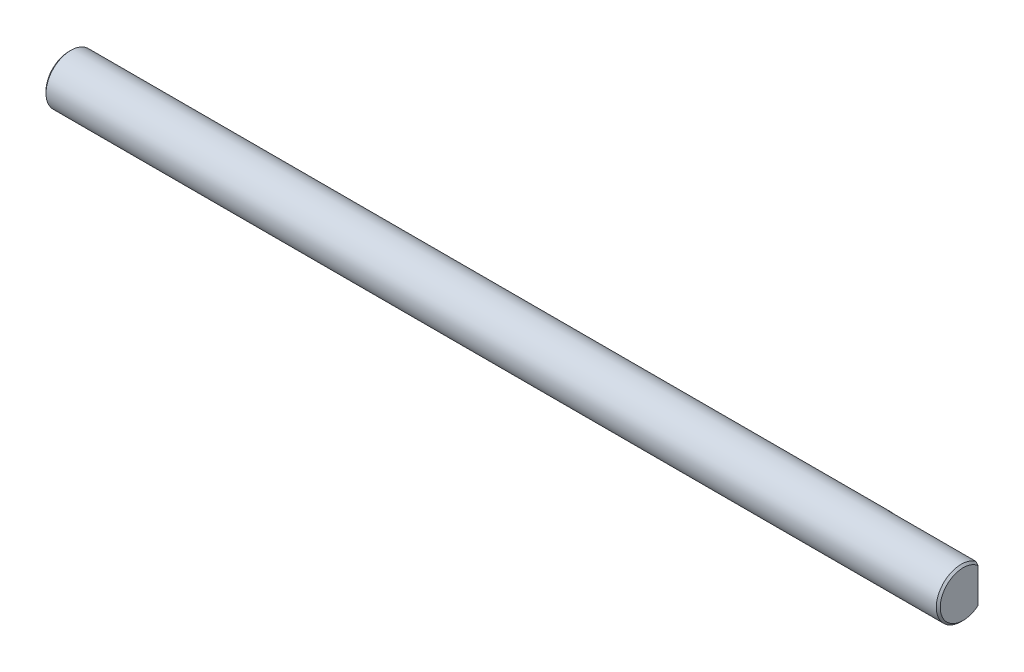
ISO-10303-21;
HEADER;
FILE_DESCRIPTION(('STEP AP214'),'2;1');
FILE_NAME('part.step','',(''),(''),'','','');
FILE_SCHEMA(('AUTOMOTIVE_DESIGN { 1 0 10303 214 1 1 1 1 }'));
ENDSEC;
DATA;
#1=APPLICATION_CONTEXT('core data for automotive mechanical design processes');
#2=APPLICATION_PROTOCOL_DEFINITION('international standard','automotive_design',2000,#1);
#3=PRODUCT_CONTEXT('',#1,'mechanical');
#4=PRODUCT('Part','Part','',(#3));
#5=PRODUCT_RELATED_PRODUCT_CATEGORY('part','',(#4));
#6=PRODUCT_DEFINITION_FORMATION('','',#4);
#7=PRODUCT_DEFINITION_CONTEXT('part definition',#1,'design');
#8=PRODUCT_DEFINITION('design','',#6,#7);
#9=PRODUCT_DEFINITION_SHAPE('','',#8);
#10=(LENGTH_UNIT() NAMED_UNIT(*) SI_UNIT(.MILLI.,.METRE.));
#11=(NAMED_UNIT(*) PLANE_ANGLE_UNIT() SI_UNIT($,.RADIAN.));
#12=(NAMED_UNIT(*) SI_UNIT($,.STERADIAN.) SOLID_ANGLE_UNIT());
#13=UNCERTAINTY_MEASURE_WITH_UNIT(LENGTH_MEASURE(1.E-05),#10,'distance_accuracy_value','');
#14=(GEOMETRIC_REPRESENTATION_CONTEXT(3) GLOBAL_UNCERTAINTY_ASSIGNED_CONTEXT((#13)) GLOBAL_UNIT_ASSIGNED_CONTEXT((#10,
#11,#12)) REPRESENTATION_CONTEXT('',''));
#15=CARTESIAN_POINT('',(0.,0.,0.));
#16=DIRECTION('',(0.,0.,1.));
#17=DIRECTION('',(1.,0.,0.));
#18=AXIS2_PLACEMENT_3D('',#15,#16,#17);
#19=CARTESIAN_POINT('',(0.,0.,0.));
#20=DIRECTION('',(1.,0.,0.));
#21=DIRECTION('',(0.,0.,-1.));
#22=AXIS2_PLACEMENT_3D('',#19,#20,#21);
#23=PLANE('',#22);
#24=DIRECTION('',(0.,1.,0.));
#25=VECTOR('',#24,1.);
#26=CARTESIAN_POINT('',(0.,-2.5,-1.5));
#27=LINE('',#26,#25);
#28=CARTESIAN_POINT('',(0.,-1.74355957741628,-1.5));
#29=VERTEX_POINT('',#28);
#30=CARTESIAN_POINT('',(0.,1.74355957741628,-1.5));
#31=VERTEX_POINT('',#30);
#32=EDGE_CURVE('E88',#29,#31,#27,.T.);
#33=ORIENTED_EDGE('',*,*,#32,.T.);
#34=CARTESIAN_POINT('',(0.,0.,0.));
#35=DIRECTION('',(1.,0.,0.));
#36=DIRECTION('',(0.,0.,-1.));
#37=AXIS2_PLACEMENT_3D('',#34,#35,#36);
#38=CIRCLE('',#37,2.30000000000001);
#39=EDGE_CURVE('E81',#31,#29,#38,.T.);
#40=ORIENTED_EDGE('',*,*,#39,.T.);
#41=EDGE_LOOP('',(#33,#40));
#42=FACE_BOUND('',#41,.T.);
#43=ADVANCED_FACE('F40',(#42),#23,.T.);
#44=CARTESIAN_POINT('',(0.,0.,0.));
#45=DIRECTION('',(1.,0.,0.));
#46=DIRECTION('',(0.,0.,-1.));
#47=AXIS2_PLACEMENT_3D('',#44,#45,#46);
#48=CYLINDRICAL_SURFACE('',#47,2.49999999999999);
#49=CARTESIAN_POINT('',(-89.8,0.,0.));
#50=DIRECTION('',(-1.,0.,0.));
#51=DIRECTION('',(0.,0.,1.));
#52=AXIS2_PLACEMENT_3D('',#49,#50,#51);
#53=CIRCLE('',#52,2.49999999999999);
#54=CARTESIAN_POINT('',(-89.8,0.,2.49999999999999));
#55=VERTEX_POINT('',#54);
#56=EDGE_CURVE('E140',#55,#55,#53,.F.);
#57=ORIENTED_EDGE('',*,*,#56,.T.);
#58=EDGE_LOOP('',(#57));
#59=FACE_BOUND('',#58,.T.);
#60=DIRECTION('',(1.,0.,0.));
#61=VECTOR('',#60,1.);
#62=CARTESIAN_POINT('',(0.,-1.99999999999999,-1.5));
#63=LINE('',#62,#61);
#64=CARTESIAN_POINT('',(-0.199999999999998,-1.99999999999999,-1.5));
#65=VERTEX_POINT('',#64);
#66=CARTESIAN_POINT('',(-9.,-1.99999999999999,-1.5));
#67=VERTEX_POINT('',#66);
#68=EDGE_CURVE('E75',#65,#67,#63,.F.);
#69=ORIENTED_EDGE('',*,*,#68,.F.);
#70=CARTESIAN_POINT('',(-0.199999999999998,0.,0.));
#71=DIRECTION('',(1.,0.,0.));
#72=DIRECTION('',(0.,0.,-1.));
#73=AXIS2_PLACEMENT_3D('',#70,#71,#72);
#74=CIRCLE('',#73,2.49999999999999);
#75=CARTESIAN_POINT('',(-0.199999999999998,1.99999999999999,-1.5));
#76=VERTEX_POINT('',#75);
#77=EDGE_CURVE('E50',#65,#76,#74,.F.);
#78=ORIENTED_EDGE('',*,*,#77,.T.);
#79=DIRECTION('',(1.,0.,0.));
#80=VECTOR('',#79,1.);
#81=CARTESIAN_POINT('',(0.,1.99999999999999,-1.5));
#82=LINE('',#81,#80);
#83=CARTESIAN_POINT('',(-9.,1.99999999999999,-1.5));
#84=VERTEX_POINT('',#83);
#85=EDGE_CURVE('E82',#84,#76,#82,.T.);
#86=ORIENTED_EDGE('',*,*,#85,.F.);
#87=CARTESIAN_POINT('',(-9.,0.,0.));
#88=DIRECTION('',(-1.,0.,0.));
#89=DIRECTION('',(0.,0.,1.));
#90=AXIS2_PLACEMENT_3D('',#87,#88,#89);
#91=CIRCLE('',#90,2.49999999999999);
#92=EDGE_CURVE('E84',#67,#84,#91,.F.);
#93=ORIENTED_EDGE('',*,*,#92,.F.);
#94=EDGE_LOOP('',(#69,#78,#86,#93));
#95=FACE_BOUND('',#94,.T.);
#96=ADVANCED_FACE('F85',(#59,#95),#48,.T.);
#97=CARTESIAN_POINT('',(-90.,0.,0.));
#98=DIRECTION('',(-1.,0.,0.));
#99=DIRECTION('',(0.,0.,1.));
#100=AXIS2_PLACEMENT_3D('',#97,#98,#99);
#101=PLANE('',#100);
#102=CARTESIAN_POINT('',(-90.,0.,0.));
#103=DIRECTION('',(-1.,0.,0.));
#104=DIRECTION('',(0.,0.,1.));
#105=AXIS2_PLACEMENT_3D('',#102,#103,#104);
#106=CIRCLE('',#105,2.29999999999995);
#107=CARTESIAN_POINT('',(-90.,0.,2.29999999999995));
#108=VERTEX_POINT('',#107);
#109=EDGE_CURVE('E11',#108,#108,#106,.T.);
#110=ORIENTED_EDGE('',*,*,#109,.T.);
#111=EDGE_LOOP('',(#110));
#112=FACE_BOUND('',#111,.T.);
#113=ADVANCED_FACE('F122',(#112),#101,.T.);
#114=CARTESIAN_POINT('',(0.,-2.5,-1.5));
#115=DIRECTION('',(0.,0.,1.));
#116=DIRECTION('',(1.,0.,0.));
#117=AXIS2_PLACEMENT_3D('',#114,#115,#116);
#118=PLANE('',#117);
#119=ORIENTED_EDGE('',*,*,#32,.F.);
#120=CARTESIAN_POINT('',(0.,-1.74355957741628,-1.5));
#121=CARTESIAN_POINT('',(-0.0327771735003763,-1.78673352282755,-1.5));
#122=CARTESIAN_POINT('',(-0.0658324568272552,-1.82969056808689,-1.5));
#123=CARTESIAN_POINT('',(-0.132499125457533,-1.91517070741669,-1.5));
#124=CARTESIAN_POINT('',(-0.166110508797319,-1.95769380301859,-1.5));
#125=CARTESIAN_POINT('',(-0.199999999999995,-2.,-1.5));
#126=B_SPLINE_CURVE_WITH_KNOTS('',3,(#120,#121,#122,#123,#124,#125),.UNSPECIFIED.,.F.,.F.,(4,2,
4),(0.,0.162608841823252,0.325217109590421),.UNSPECIFIED.);
#127=EDGE_CURVE('E64',#29,#65,#126,.T.);
#128=ORIENTED_EDGE('',*,*,#127,.T.);
#129=ORIENTED_EDGE('',*,*,#68,.T.);
#130=DIRECTION('',(0.,1.,0.));
#131=VECTOR('',#130,1.);
#132=CARTESIAN_POINT('',(-9.,-2.5,-1.5));
#133=LINE('',#132,#131);
#134=EDGE_CURVE('E79',#67,#84,#133,.T.);
#135=ORIENTED_EDGE('',*,*,#134,.T.);
#136=ORIENTED_EDGE('',*,*,#85,.T.);
#137=CARTESIAN_POINT('',(-0.199999999999998,1.99999999999999,-1.5));
#138=CARTESIAN_POINT('',(-0.166110508797321,1.95769380301858,-1.5));
#139=CARTESIAN_POINT('',(-0.132499125457534,1.91517070741669,-1.5));
#140=CARTESIAN_POINT('',(-0.0658324568272537,1.82969056808689,-1.5));
#141=CARTESIAN_POINT('',(-0.0327771735003731,1.78673352282755,-1.5));
#142=CARTESIAN_POINT('',(0.,1.74355957741629,-1.5));
#143=B_SPLINE_CURVE_WITH_KNOTS('',3,(#137,#138,#139,#140,#141,#142),.UNSPECIFIED.,.F.,.F.,(4,2,
4),(0.,0.162608267767169,0.325217109590421),.UNSPECIFIED.);
#144=EDGE_CURVE('E102',#76,#31,#143,.T.);
#145=ORIENTED_EDGE('',*,*,#144,.T.);
#146=EDGE_LOOP('',(#119,#128,#129,#135,#136,#145));
#147=FACE_BOUND('',#146,.T.);
#148=ADVANCED_FACE('F77',(#147),#118,.F.);
#149=CARTESIAN_POINT('',(-9.,-2.5,-1.5));
#150=DIRECTION('',(-1.,0.,0.));
#151=DIRECTION('',(0.,0.,1.));
#152=AXIS2_PLACEMENT_3D('',#149,#150,#151);
#153=PLANE('',#152);
#154=ORIENTED_EDGE('',*,*,#134,.F.);
#155=ORIENTED_EDGE('',*,*,#92,.T.);
#156=EDGE_LOOP('',(#154,#155));
#157=FACE_BOUND('',#156,.T.);
#158=ADVANCED_FACE('F90',(#157),#153,.F.);
#159=CARTESIAN_POINT('',(0.,0.,0.));
#160=DIRECTION('',(-1.,0.,0.));
#161=DIRECTION('',(0.,0.,1.));
#162=AXIS2_PLACEMENT_3D('',#159,#160,#161);
#163=CONICAL_SURFACE('',#162,2.30000000000001,0.785398163397415);
#164=ORIENTED_EDGE('',*,*,#144,.F.);
#165=ORIENTED_EDGE('',*,*,#77,.F.);
#166=ORIENTED_EDGE('',*,*,#127,.F.);
#167=ORIENTED_EDGE('',*,*,#39,.F.);
#168=EDGE_LOOP('',(#164,#165,#166,#167));
#169=FACE_BOUND('',#168,.T.);
#170=ADVANCED_FACE('F116',(#169),#163,.T.);
#171=CARTESIAN_POINT('',(-89.8,0.,0.));
#172=DIRECTION('',(1.,0.,0.));
#173=DIRECTION('',(0.,0.,-1.));
#174=AXIS2_PLACEMENT_3D('',#171,#172,#173);
#175=CONICAL_SURFACE('',#174,2.49999999999999,0.785398163397482);
#176=ORIENTED_EDGE('',*,*,#109,.F.);
#177=EDGE_LOOP('',(#176));
#178=FACE_BOUND('',#177,.T.);
#179=ORIENTED_EDGE('',*,*,#56,.F.);
#180=EDGE_LOOP('',(#179));
#181=FACE_BOUND('',#180,.T.);
#182=ADVANCED_FACE('F43',(#178,#181),#175,.T.);
#183=CLOSED_SHELL('',(#43,#96,#113,#148,#158,#170,#182));
#184=MANIFOLD_SOLID_BREP('B2',#183);
#185=ADVANCED_BREP_SHAPE_REPRESENTATION('',(#18,#184),#14);
#186=SHAPE_DEFINITION_REPRESENTATION(#9,#185);
ENDSEC;
END-ISO-10303-21;
